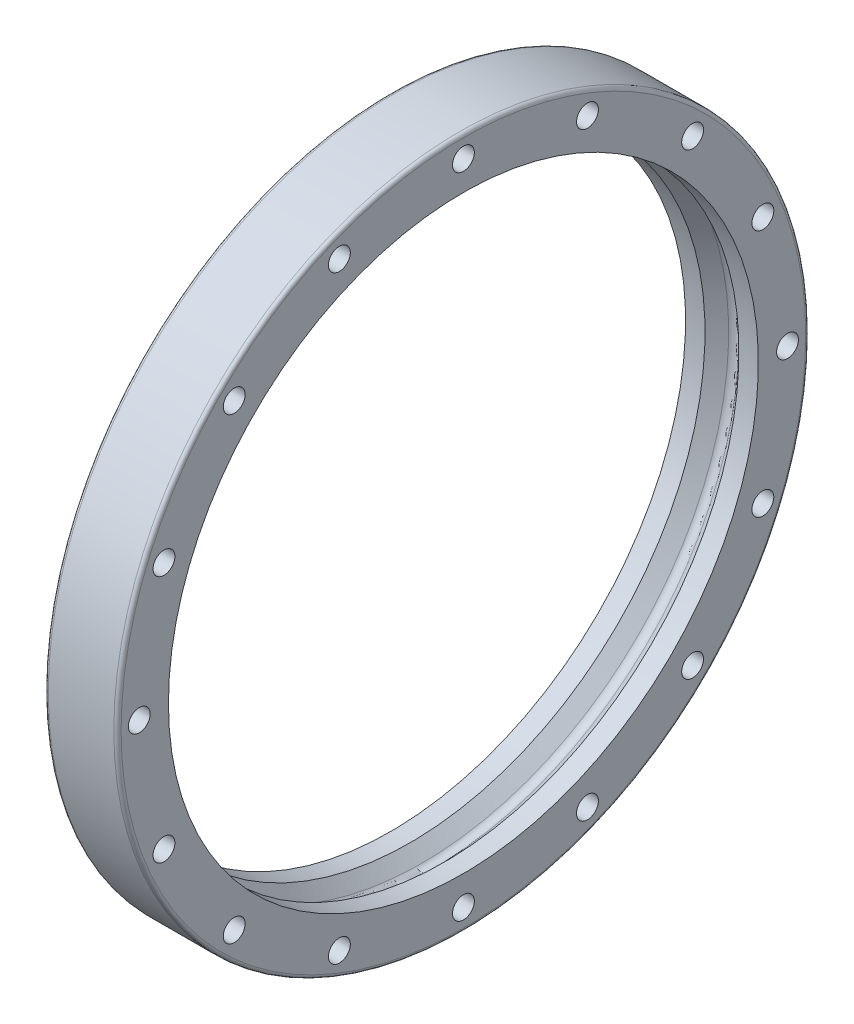
ISO-10303-21;
HEADER;
FILE_DESCRIPTION(('STEP AP214'),'2;1');
FILE_NAME('part.step','',(''),(''),'','','');
FILE_SCHEMA(('AUTOMOTIVE_DESIGN { 1 0 10303 214 1 1 1 1 }'));
ENDSEC;
DATA;
#1=APPLICATION_CONTEXT('core data for automotive mechanical design processes');
#2=APPLICATION_PROTOCOL_DEFINITION('international standard','automotive_design',2000,#1);
#3=PRODUCT_CONTEXT('',#1,'mechanical');
#4=PRODUCT('Part','Part','',(#3));
#5=PRODUCT_RELATED_PRODUCT_CATEGORY('part','',(#4));
#6=PRODUCT_DEFINITION_FORMATION('','',#4);
#7=PRODUCT_DEFINITION_CONTEXT('part definition',#1,'design');
#8=PRODUCT_DEFINITION('design','',#6,#7);
#9=PRODUCT_DEFINITION_SHAPE('','',#8);
#10=(LENGTH_UNIT() NAMED_UNIT(*) SI_UNIT(.MILLI.,.METRE.));
#11=(NAMED_UNIT(*) PLANE_ANGLE_UNIT() SI_UNIT($,.RADIAN.));
#12=(NAMED_UNIT(*) SI_UNIT($,.STERADIAN.) SOLID_ANGLE_UNIT());
#13=UNCERTAINTY_MEASURE_WITH_UNIT(LENGTH_MEASURE(1.E-05),#10,'distance_accuracy_value','');
#14=(GEOMETRIC_REPRESENTATION_CONTEXT(3) GLOBAL_UNCERTAINTY_ASSIGNED_CONTEXT((#13)) GLOBAL_UNIT_ASSIGNED_CONTEXT((#10,
#11,#12)) REPRESENTATION_CONTEXT('',''));
#15=CARTESIAN_POINT('',(0.,0.,0.));
#16=DIRECTION('',(0.,0.,1.));
#17=DIRECTION('',(1.,0.,0.));
#18=AXIS2_PLACEMENT_3D('',#15,#16,#17);
#19=CARTESIAN_POINT('',(0.,0.,0.));
#20=DIRECTION('',(1.,0.,0.));
#21=DIRECTION('',(0.,0.,-1.));
#22=AXIS2_PLACEMENT_3D('',#19,#20,#21);
#23=CONICAL_SURFACE('',#22,85.6568542494924,0.78539816339745);
#24=CARTESIAN_POINT('',(-1.4142135623731,0.,0.));
#25=DIRECTION('',(-1.,0.,0.));
#26=DIRECTION('',(0.,0.,1.));
#27=AXIS2_PLACEMENT_3D('',#24,#25,#26);
#28=CIRCLE('',#27,84.2426406871193);
#29=CARTESIAN_POINT('',(-1.4142135623731,0.,84.2426406871193));
#30=VERTEX_POINT('',#29);
#31=EDGE_CURVE('E53',#30,#30,#28,.F.);
#32=ORIENTED_EDGE('',*,*,#31,.T.);
#33=EDGE_LOOP('',(#32));
#34=FACE_BOUND('',#33,.T.);
#35=CARTESIAN_POINT('',(-4.65685424949237,0.,0.));
#36=DIRECTION('',(-1.,0.,0.));
#37=DIRECTION('',(0.,0.,1.));
#38=AXIS2_PLACEMENT_3D('',#35,#36,#37);
#39=CIRCLE('',#38,81.);
#40=CARTESIAN_POINT('',(-4.65685424949237,0.,81.));
#41=VERTEX_POINT('',#40);
#42=EDGE_CURVE('E68',#41,#41,#39,.T.);
#43=ORIENTED_EDGE('',*,*,#42,.T.);
#44=EDGE_LOOP('',(#43));
#45=FACE_BOUND('',#44,.T.);
#46=ADVANCED_FACE('F33',(#34,#45),#23,.F.);
#47=CARTESIAN_POINT('',(0.,0.,0.));
#48=DIRECTION('',(-1.,0.,0.));
#49=DIRECTION('',(0.,0.,1.));
#50=AXIS2_PLACEMENT_3D('',#47,#48,#49);
#51=CONICAL_SURFACE('',#50,85.6568542494924,0.78539816339745);
#52=CARTESIAN_POINT('',(1.41421356237313,0.,0.));
#53=DIRECTION('',(1.,0.,0.));
#54=DIRECTION('',(0.,0.,-1.));
#55=AXIS2_PLACEMENT_3D('',#52,#53,#54);
#56=CIRCLE('',#55,84.2426406871193);
#57=CARTESIAN_POINT('',(1.41421356237313,0.,-84.2426406871193));
#58=VERTEX_POINT('',#57);
#59=EDGE_CURVE('E56',#58,#58,#56,.F.);
#60=ORIENTED_EDGE('',*,*,#59,.T.);
#61=EDGE_LOOP('',(#60));
#62=FACE_BOUND('',#61,.T.);
#63=CARTESIAN_POINT('',(4.65685424949238,0.,0.));
#64=DIRECTION('',(-1.,0.,0.));
#65=DIRECTION('',(0.,0.,1.));
#66=AXIS2_PLACEMENT_3D('',#63,#64,#65);
#67=CIRCLE('',#66,81.);
#68=CARTESIAN_POINT('',(4.65685424949238,0.,81.));
#69=VERTEX_POINT('',#68);
#70=EDGE_CURVE('E59',#69,#69,#67,.T.);
#71=ORIENTED_EDGE('',*,*,#70,.F.);
#72=EDGE_LOOP('',(#71));
#73=FACE_BOUND('',#72,.T.);
#74=ADVANCED_FACE('F202',(#62,#73),#51,.F.);
#75=CARTESIAN_POINT('',(-42.0673076923077,0.,0.));
#76=DIRECTION('',(-1.,0.,0.));
#77=DIRECTION('',(0.,0.,1.));
#78=AXIS2_PLACEMENT_3D('',#75,#76,#77);
#79=CYLINDRICAL_SURFACE('',#78,81.);
#80=ORIENTED_EDGE('',*,*,#70,.T.);
#81=EDGE_LOOP('',(#80));
#82=FACE_BOUND('',#81,.T.);
#83=CARTESIAN_POINT('',(10.,0.,0.));
#84=DIRECTION('',(-1.,0.,0.));
#85=DIRECTION('',(0.,0.,1.));
#86=AXIS2_PLACEMENT_3D('',#83,#84,#85);
#87=CIRCLE('',#86,81.);
#88=CARTESIAN_POINT('',(10.,0.,81.));
#89=VERTEX_POINT('',#88);
#90=EDGE_CURVE('E62',#89,#89,#87,.T.);
#91=ORIENTED_EDGE('',*,*,#90,.F.);
#92=EDGE_LOOP('',(#91));
#93=FACE_BOUND('',#92,.T.);
#94=ADVANCED_FACE('F183',(#82,#93),#79,.F.);
#95=CARTESIAN_POINT('',(10.,0.,0.));
#96=DIRECTION('',(1.,0.,0.));
#97=DIRECTION('',(0.,0.,-1.));
#98=AXIS2_PLACEMENT_3D('',#95,#96,#97);
#99=PLANE('',#98);
#100=CARTESIAN_POINT('',(10.,0.,0.));
#101=DIRECTION('',(1.,0.,0.));
#102=DIRECTION('',(0.,0.,-1.));
#103=AXIS2_PLACEMENT_3D('',#100,#101,#102);
#104=CIRCLE('',#103,94.);
#105=CARTESIAN_POINT('',(10.,0.,-94.));
#106=VERTEX_POINT('',#105);
#107=EDGE_CURVE('E40',#106,#106,#104,.T.);
#108=ORIENTED_EDGE('',*,*,#107,.T.);
#109=EDGE_LOOP('',(#108));
#110=FACE_BOUND('',#109,.T.);
#111=CARTESIAN_POINT('',(10.,62.9325035256026,-62.9325035256028));
#112=DIRECTION('',(1.,0.,0.));
#113=DIRECTION('',(0.,-0.707106781186549,-0.707106781186546));
#114=AXIS2_PLACEMENT_3D('',#111,#112,#113);
#115=CIRCLE('',#114,3.);
#116=CARTESIAN_POINT('',(10.,60.811183182043,-65.0538238691625));
#117=VERTEX_POINT('',#116);
#118=EDGE_CURVE('E127',#117,#117,#115,.T.);
#119=ORIENTED_EDGE('',*,*,#118,.F.);
#120=EDGE_LOOP('',(#119));
#121=FACE_BOUND('',#120,.T.);
#122=CARTESIAN_POINT('',(10.,34.0588254804928,-82.2252783935046));
#123=DIRECTION('',(1.,0.,0.));
#124=DIRECTION('',(0.,-0.923879532511288,-0.382683432365087));
#125=AXIS2_PLACEMENT_3D('',#122,#123,#124);
#126=CIRCLE('',#125,3.);
#127=CARTESIAN_POINT('',(10.,31.2871868829589,-83.3733286905999));
#128=VERTEX_POINT('',#127);
#129=EDGE_CURVE('E121',#128,#128,#126,.T.);
#130=ORIENTED_EDGE('',*,*,#129,.F.);
#131=EDGE_LOOP('',(#130));
#132=FACE_BOUND('',#131,.T.);
#133=CARTESIAN_POINT('',(10.,-3.10741839157039E-13,-89.));
#134=DIRECTION('',(1.,0.,0.));
#135=DIRECTION('',(0.,-1.,0.));
#136=AXIS2_PLACEMENT_3D('',#133,#134,#135);
#137=CIRCLE('',#136,3.);
#138=CARTESIAN_POINT('',(10.,-3.00000000000031,-89.));
#139=VERTEX_POINT('',#138);
#140=EDGE_CURVE('E115',#139,#139,#137,.T.);
#141=ORIENTED_EDGE('',*,*,#140,.F.);
#142=EDGE_LOOP('',(#141));
#143=FACE_BOUND('',#142,.T.);
#144=CARTESIAN_POINT('',(10.,-34.0588254804934,-82.2252783935044));
#145=DIRECTION('',(1.,0.,0.));
#146=DIRECTION('',(0.,-0.923879532511285,0.382683432365094));
#147=AXIS2_PLACEMENT_3D('',#144,#145,#146);
#148=CIRCLE('',#147,3.);
#149=CARTESIAN_POINT('',(10.,-36.8304640780272,-81.0772280964091));
#150=VERTEX_POINT('',#149);
#151=EDGE_CURVE('E109',#150,#150,#148,.T.);
#152=ORIENTED_EDGE('',*,*,#151,.F.);
#153=EDGE_LOOP('',(#152));
#154=FACE_BOUND('',#153,.T.);
#155=CARTESIAN_POINT('',(10.,-62.9325035256031,-62.9325035256024));
#156=DIRECTION('',(1.,0.,0.));
#157=DIRECTION('',(0.,-0.707106781186544,0.707106781186551));
#158=AXIS2_PLACEMENT_3D('',#155,#156,#157);
#159=CIRCLE('',#158,3.);
#160=CARTESIAN_POINT('',(10.,-65.0538238691627,-60.8111831820427));
#161=VERTEX_POINT('',#160);
#162=EDGE_CURVE('E103',#161,#161,#159,.T.);
#163=ORIENTED_EDGE('',*,*,#162,.F.);
#164=EDGE_LOOP('',(#163));
#165=FACE_BOUND('',#164,.T.);
#166=CARTESIAN_POINT('',(10.,-82.2252783935047,-34.0588254804925));
#167=DIRECTION('',(1.,0.,0.));
#168=DIRECTION('',(0.,-0.382683432365084,0.923879532511289));
#169=AXIS2_PLACEMENT_3D('',#166,#167,#168);
#170=CIRCLE('',#169,3.);
#171=CARTESIAN_POINT('',(10.,-83.3733286906,-31.2871868829586));
#172=VERTEX_POINT('',#171);
#173=EDGE_CURVE('E97',#172,#172,#170,.T.);
#174=ORIENTED_EDGE('',*,*,#173,.F.);
#175=EDGE_LOOP('',(#174));
#176=FACE_BOUND('',#175,.T.);
#177=CARTESIAN_POINT('',(10.,-89.,0.));
#178=DIRECTION('',(1.,0.,0.));
#179=DIRECTION('',(0.,0.,1.));
#180=AXIS2_PLACEMENT_3D('',#177,#178,#179);
#181=CIRCLE('',#180,3.);
#182=CARTESIAN_POINT('',(10.,-89.,3.));
#183=VERTEX_POINT('',#182);
#184=EDGE_CURVE('E91',#183,#183,#181,.T.);
#185=ORIENTED_EDGE('',*,*,#184,.F.);
#186=EDGE_LOOP('',(#185));
#187=FACE_BOUND('',#186,.T.);
#188=CARTESIAN_POINT('',(10.,-82.2252783935043,34.0588254804936));
#189=DIRECTION('',(1.,0.,0.));
#190=DIRECTION('',(0.,0.382683432365097,0.923879532511284));
#191=AXIS2_PLACEMENT_3D('',#188,#189,#190);
#192=CIRCLE('',#191,3.);
#193=CARTESIAN_POINT('',(10.,-81.077228096409,36.8304640780275));
#194=VERTEX_POINT('',#193);
#195=EDGE_CURVE('E84',#194,#194,#192,.T.);
#196=ORIENTED_EDGE('',*,*,#195,.F.);
#197=EDGE_LOOP('',(#196));
#198=FACE_BOUND('',#197,.T.);
#199=CARTESIAN_POINT('',(10.,-62.9325035256022,62.9325035256033));
#200=DIRECTION('',(1.,0.,0.));
#201=DIRECTION('',(0.,0.707106781186554,0.707106781186541));
#202=AXIS2_PLACEMENT_3D('',#199,#200,#201);
#203=CIRCLE('',#202,3.);
#204=CARTESIAN_POINT('',(10.,-60.8111831820425,65.0538238691629));
#205=VERTEX_POINT('',#204);
#206=EDGE_CURVE('E162',#205,#205,#203,.T.);
#207=ORIENTED_EDGE('',*,*,#206,.F.);
#208=EDGE_LOOP('',(#207));
#209=FACE_BOUND('',#208,.T.);
#210=CARTESIAN_POINT('',(10.,-34.0588254804922,82.2252783935049));
#211=DIRECTION('',(1.,0.,0.));
#212=DIRECTION('',(0.,0.923879532511291,0.382683432365081));
#213=AXIS2_PLACEMENT_3D('',#210,#211,#212);
#214=CIRCLE('',#213,3.);
#215=CARTESIAN_POINT('',(10.,-31.2871868829583,83.3733286906001));
#216=VERTEX_POINT('',#215);
#217=EDGE_CURVE('E156',#216,#216,#214,.T.);
#218=ORIENTED_EDGE('',*,*,#217,.F.);
#219=EDGE_LOOP('',(#218));
#220=FACE_BOUND('',#219,.T.);
#221=CARTESIAN_POINT('',(10.,9.32225517471117E-13,89.));
#222=DIRECTION('',(1.,0.,0.));
#223=DIRECTION('',(0.,1.,0.));
#224=AXIS2_PLACEMENT_3D('',#221,#222,#223);
#225=CIRCLE('',#224,3.);
#226=CARTESIAN_POINT('',(10.,3.00000000000094,89.));
#227=VERTEX_POINT('',#226);
#228=EDGE_CURVE('E150',#227,#227,#225,.T.);
#229=ORIENTED_EDGE('',*,*,#228,.F.);
#230=EDGE_LOOP('',(#229));
#231=FACE_BOUND('',#230,.T.);
#232=CARTESIAN_POINT('',(10.,34.0588254804939,82.2252783935041));
#233=DIRECTION('',(1.,0.,0.));
#234=DIRECTION('',(0.,0.923879532511283,-0.3826834323651));
#235=AXIS2_PLACEMENT_3D('',#232,#233,#234);
#236=CIRCLE('',#235,3.);
#237=CARTESIAN_POINT('',(10.,36.8304640780277,81.0772280964088));
#238=VERTEX_POINT('',#237);
#239=EDGE_CURVE('E144',#238,#238,#236,.T.);
#240=ORIENTED_EDGE('',*,*,#239,.F.);
#241=EDGE_LOOP('',(#240));
#242=FACE_BOUND('',#241,.T.);
#243=CARTESIAN_POINT('',(10.,62.9325035256035,62.932503525602));
#244=DIRECTION('',(1.,0.,0.));
#245=DIRECTION('',(0.,0.707106781186539,-0.707106781186556));
#246=AXIS2_PLACEMENT_3D('',#243,#244,#245);
#247=CIRCLE('',#246,3.);
#248=CARTESIAN_POINT('',(10.,65.0538238691631,60.8111831820423));
#249=VERTEX_POINT('',#248);
#250=EDGE_CURVE('E138',#249,#249,#247,.T.);
#251=ORIENTED_EDGE('',*,*,#250,.F.);
#252=EDGE_LOOP('',(#251));
#253=FACE_BOUND('',#252,.T.);
#254=CARTESIAN_POINT('',(10.,82.225278393505,34.0588254804919));
#255=DIRECTION('',(1.,0.,0.));
#256=DIRECTION('',(0.,0.382683432365077,-0.923879532511292));
#257=AXIS2_PLACEMENT_3D('',#254,#255,#256);
#258=CIRCLE('',#257,3.);
#259=CARTESIAN_POINT('',(10.,83.3733286906002,31.287186882958));
#260=VERTEX_POINT('',#259);
#261=EDGE_CURVE('E132',#260,#260,#258,.T.);
#262=ORIENTED_EDGE('',*,*,#261,.F.);
#263=EDGE_LOOP('',(#262));
#264=FACE_BOUND('',#263,.T.);
#265=CARTESIAN_POINT('',(10.,82.2252783935045,-34.0588254804931));
#266=DIRECTION('',(1.,0.,0.));
#267=DIRECTION('',(0.,-0.382683432365091,-0.923879532511287));
#268=AXIS2_PLACEMENT_3D('',#265,#266,#267);
#269=CIRCLE('',#268,3.);
#270=CARTESIAN_POINT('',(10.,81.0772280964092,-36.8304640780269));
#271=VERTEX_POINT('',#270);
#272=EDGE_CURVE('E78',#271,#271,#269,.T.);
#273=ORIENTED_EDGE('',*,*,#272,.F.);
#274=EDGE_LOOP('',(#273));
#275=FACE_BOUND('',#274,.T.);
#276=CARTESIAN_POINT('',(10.,89.,0.));
#277=DIRECTION('',(1.,0.,0.));
#278=DIRECTION('',(0.,0.,-1.));
#279=AXIS2_PLACEMENT_3D('',#276,#277,#278);
#280=CIRCLE('',#279,3.);
#281=CARTESIAN_POINT('',(10.,89.,-3.));
#282=VERTEX_POINT('',#281);
#283=EDGE_CURVE('E72',#282,#282,#280,.T.);
#284=ORIENTED_EDGE('',*,*,#283,.F.);
#285=EDGE_LOOP('',(#284));
#286=FACE_BOUND('',#285,.T.);
#287=ORIENTED_EDGE('',*,*,#90,.T.);
#288=EDGE_LOOP('',(#287));
#289=FACE_BOUND('',#288,.T.);
#290=ADVANCED_FACE('F179',(#110,#121,#132,#143,#154,#165,#176,#187,#198,#209,#220,#231,#242,
#253,#264,#275,#286,#289),#99,.T.);
#291=CARTESIAN_POINT('',(-42.0673076923077,0.,0.));
#292=DIRECTION('',(-1.,0.,0.));
#293=DIRECTION('',(0.,0.,1.));
#294=AXIS2_PLACEMENT_3D('',#291,#292,#293);
#295=CYLINDRICAL_SURFACE('',#294,95.);
#296=CARTESIAN_POINT('',(9.,0.,0.));
#297=DIRECTION('',(1.,0.,0.));
#298=DIRECTION('',(0.,0.,-1.));
#299=AXIS2_PLACEMENT_3D('',#296,#297,#298);
#300=CIRCLE('',#299,95.);
#301=CARTESIAN_POINT('',(9.,0.,-95.));
#302=VERTEX_POINT('',#301);
#303=EDGE_CURVE('E44',#302,#302,#300,.F.);
#304=ORIENTED_EDGE('',*,*,#303,.T.);
#305=EDGE_LOOP('',(#304));
#306=FACE_BOUND('',#305,.T.);
#307=CARTESIAN_POINT('',(-9.,0.,0.));
#308=DIRECTION('',(1.,0.,0.));
#309=DIRECTION('',(0.,0.,-1.));
#310=AXIS2_PLACEMENT_3D('',#307,#308,#309);
#311=CIRCLE('',#310,95.);
#312=CARTESIAN_POINT('',(-9.,0.,-95.));
#313=VERTEX_POINT('',#312);
#314=EDGE_CURVE('E48',#313,#313,#311,.T.);
#315=ORIENTED_EDGE('',*,*,#314,.T.);
#316=EDGE_LOOP('',(#315));
#317=FACE_BOUND('',#316,.T.);
#318=ADVANCED_FACE('F182',(#306,#317),#295,.T.);
#319=CARTESIAN_POINT('',(-10.,0.,0.));
#320=DIRECTION('',(1.,0.,0.));
#321=DIRECTION('',(0.,0.,-1.));
#322=AXIS2_PLACEMENT_3D('',#319,#320,#321);
#323=PLANE('',#322);
#324=CARTESIAN_POINT('',(-10.,0.,0.));
#325=DIRECTION('',(1.,0.,0.));
#326=DIRECTION('',(0.,0.,-1.));
#327=AXIS2_PLACEMENT_3D('',#324,#325,#326);
#328=CIRCLE('',#327,94.);
#329=CARTESIAN_POINT('',(-10.,0.,-94.));
#330=VERTEX_POINT('',#329);
#331=EDGE_CURVE('E10',#330,#330,#328,.F.);
#332=ORIENTED_EDGE('',*,*,#331,.T.);
#333=EDGE_LOOP('',(#332));
#334=FACE_BOUND('',#333,.T.);
#335=CARTESIAN_POINT('',(-10.,62.9325035256026,-62.9325035256028));
#336=DIRECTION('',(1.,0.,0.));
#337=DIRECTION('',(0.,-0.707106781186549,-0.707106781186546));
#338=AXIS2_PLACEMENT_3D('',#335,#336,#337);
#339=CIRCLE('',#338,3.);
#340=CARTESIAN_POINT('',(-10.,60.811183182043,-65.0538238691625));
#341=VERTEX_POINT('',#340);
#342=EDGE_CURVE('E81',#341,#341,#339,.T.);
#343=ORIENTED_EDGE('',*,*,#342,.T.);
#344=EDGE_LOOP('',(#343));
#345=FACE_BOUND('',#344,.T.);
#346=CARTESIAN_POINT('',(-10.,34.0588254804928,-82.2252783935046));
#347=DIRECTION('',(1.,0.,0.));
#348=DIRECTION('',(0.,-0.923879532511288,-0.382683432365087));
#349=AXIS2_PLACEMENT_3D('',#346,#347,#348);
#350=CIRCLE('',#349,3.);
#351=CARTESIAN_POINT('',(-10.,31.2871868829589,-83.3733286905999));
#352=VERTEX_POINT('',#351);
#353=EDGE_CURVE('E124',#352,#352,#350,.T.);
#354=ORIENTED_EDGE('',*,*,#353,.T.);
#355=EDGE_LOOP('',(#354));
#356=FACE_BOUND('',#355,.T.);
#357=CARTESIAN_POINT('',(-10.,-3.10741839157039E-13,-89.));
#358=DIRECTION('',(1.,0.,0.));
#359=DIRECTION('',(0.,-1.,0.));
#360=AXIS2_PLACEMENT_3D('',#357,#358,#359);
#361=CIRCLE('',#360,3.);
#362=CARTESIAN_POINT('',(-10.,-3.00000000000031,-89.));
#363=VERTEX_POINT('',#362);
#364=EDGE_CURVE('E118',#363,#363,#361,.T.);
#365=ORIENTED_EDGE('',*,*,#364,.T.);
#366=EDGE_LOOP('',(#365));
#367=FACE_BOUND('',#366,.T.);
#368=CARTESIAN_POINT('',(-10.,-34.0588254804934,-82.2252783935044));
#369=DIRECTION('',(1.,0.,0.));
#370=DIRECTION('',(0.,-0.923879532511285,0.382683432365094));
#371=AXIS2_PLACEMENT_3D('',#368,#369,#370);
#372=CIRCLE('',#371,3.);
#373=CARTESIAN_POINT('',(-10.,-36.8304640780272,-81.0772280964091));
#374=VERTEX_POINT('',#373);
#375=EDGE_CURVE('E112',#374,#374,#372,.T.);
#376=ORIENTED_EDGE('',*,*,#375,.T.);
#377=EDGE_LOOP('',(#376));
#378=FACE_BOUND('',#377,.T.);
#379=CARTESIAN_POINT('',(-10.,-62.9325035256031,-62.9325035256024));
#380=DIRECTION('',(1.,0.,0.));
#381=DIRECTION('',(0.,-0.707106781186544,0.707106781186551));
#382=AXIS2_PLACEMENT_3D('',#379,#380,#381);
#383=CIRCLE('',#382,3.);
#384=CARTESIAN_POINT('',(-10.,-65.0538238691627,-60.8111831820427));
#385=VERTEX_POINT('',#384);
#386=EDGE_CURVE('E106',#385,#385,#383,.T.);
#387=ORIENTED_EDGE('',*,*,#386,.T.);
#388=EDGE_LOOP('',(#387));
#389=FACE_BOUND('',#388,.T.);
#390=CARTESIAN_POINT('',(-10.,-82.2252783935047,-34.0588254804925));
#391=DIRECTION('',(1.,0.,0.));
#392=DIRECTION('',(0.,-0.382683432365084,0.923879532511289));
#393=AXIS2_PLACEMENT_3D('',#390,#391,#392);
#394=CIRCLE('',#393,3.);
#395=CARTESIAN_POINT('',(-10.,-83.3733286906,-31.2871868829586));
#396=VERTEX_POINT('',#395);
#397=EDGE_CURVE('E100',#396,#396,#394,.T.);
#398=ORIENTED_EDGE('',*,*,#397,.T.);
#399=EDGE_LOOP('',(#398));
#400=FACE_BOUND('',#399,.T.);
#401=CARTESIAN_POINT('',(-10.,-89.,0.));
#402=DIRECTION('',(1.,0.,0.));
#403=DIRECTION('',(0.,0.,1.));
#404=AXIS2_PLACEMENT_3D('',#401,#402,#403);
#405=CIRCLE('',#404,3.);
#406=CARTESIAN_POINT('',(-10.,-89.,3.));
#407=VERTEX_POINT('',#406);
#408=EDGE_CURVE('E94',#407,#407,#405,.T.);
#409=ORIENTED_EDGE('',*,*,#408,.T.);
#410=EDGE_LOOP('',(#409));
#411=FACE_BOUND('',#410,.T.);
#412=CARTESIAN_POINT('',(-10.,-82.2252783935043,34.0588254804936));
#413=DIRECTION('',(1.,0.,0.));
#414=DIRECTION('',(0.,0.382683432365097,0.923879532511284));
#415=AXIS2_PLACEMENT_3D('',#412,#413,#414);
#416=CIRCLE('',#415,3.);
#417=CARTESIAN_POINT('',(-10.,-81.077228096409,36.8304640780275));
#418=VERTEX_POINT('',#417);
#419=EDGE_CURVE('E87',#418,#418,#416,.T.);
#420=ORIENTED_EDGE('',*,*,#419,.T.);
#421=EDGE_LOOP('',(#420));
#422=FACE_BOUND('',#421,.T.);
#423=CARTESIAN_POINT('',(-10.,-62.9325035256022,62.9325035256033));
#424=DIRECTION('',(1.,0.,0.));
#425=DIRECTION('',(0.,0.707106781186554,0.707106781186541));
#426=AXIS2_PLACEMENT_3D('',#423,#424,#425);
#427=CIRCLE('',#426,3.);
#428=CARTESIAN_POINT('',(-10.,-60.8111831820425,65.0538238691629));
#429=VERTEX_POINT('',#428);
#430=EDGE_CURVE('E88',#429,#429,#427,.T.);
#431=ORIENTED_EDGE('',*,*,#430,.T.);
#432=EDGE_LOOP('',(#431));
#433=FACE_BOUND('',#432,.T.);
#434=CARTESIAN_POINT('',(-10.,-34.0588254804922,82.2252783935049));
#435=DIRECTION('',(1.,0.,0.));
#436=DIRECTION('',(0.,0.923879532511291,0.382683432365081));
#437=AXIS2_PLACEMENT_3D('',#434,#435,#436);
#438=CIRCLE('',#437,3.);
#439=CARTESIAN_POINT('',(-10.,-31.2871868829583,83.3733286906001));
#440=VERTEX_POINT('',#439);
#441=EDGE_CURVE('E159',#440,#440,#438,.T.);
#442=ORIENTED_EDGE('',*,*,#441,.T.);
#443=EDGE_LOOP('',(#442));
#444=FACE_BOUND('',#443,.T.);
#445=CARTESIAN_POINT('',(-10.,9.32225517471117E-13,89.));
#446=DIRECTION('',(1.,0.,0.));
#447=DIRECTION('',(0.,1.,0.));
#448=AXIS2_PLACEMENT_3D('',#445,#446,#447);
#449=CIRCLE('',#448,3.);
#450=CARTESIAN_POINT('',(-10.,3.00000000000094,89.));
#451=VERTEX_POINT('',#450);
#452=EDGE_CURVE('E153',#451,#451,#449,.T.);
#453=ORIENTED_EDGE('',*,*,#452,.T.);
#454=EDGE_LOOP('',(#453));
#455=FACE_BOUND('',#454,.T.);
#456=CARTESIAN_POINT('',(-10.,34.0588254804939,82.2252783935041));
#457=DIRECTION('',(1.,0.,0.));
#458=DIRECTION('',(0.,0.923879532511283,-0.3826834323651));
#459=AXIS2_PLACEMENT_3D('',#456,#457,#458);
#460=CIRCLE('',#459,3.);
#461=CARTESIAN_POINT('',(-10.,36.8304640780277,81.0772280964088));
#462=VERTEX_POINT('',#461);
#463=EDGE_CURVE('E147',#462,#462,#460,.T.);
#464=ORIENTED_EDGE('',*,*,#463,.T.);
#465=EDGE_LOOP('',(#464));
#466=FACE_BOUND('',#465,.T.);
#467=CARTESIAN_POINT('',(-10.,62.9325035256035,62.932503525602));
#468=DIRECTION('',(1.,0.,0.));
#469=DIRECTION('',(0.,0.707106781186539,-0.707106781186556));
#470=AXIS2_PLACEMENT_3D('',#467,#468,#469);
#471=CIRCLE('',#470,3.);
#472=CARTESIAN_POINT('',(-10.,65.0538238691631,60.8111831820423));
#473=VERTEX_POINT('',#472);
#474=EDGE_CURVE('E141',#473,#473,#471,.T.);
#475=ORIENTED_EDGE('',*,*,#474,.T.);
#476=EDGE_LOOP('',(#475));
#477=FACE_BOUND('',#476,.T.);
#478=CARTESIAN_POINT('',(-10.,82.225278393505,34.0588254804919));
#479=DIRECTION('',(1.,0.,0.));
#480=DIRECTION('',(0.,0.382683432365077,-0.923879532511292));
#481=AXIS2_PLACEMENT_3D('',#478,#479,#480);
#482=CIRCLE('',#481,3.);
#483=CARTESIAN_POINT('',(-10.,83.3733286906002,31.287186882958));
#484=VERTEX_POINT('',#483);
#485=EDGE_CURVE('E135',#484,#484,#482,.T.);
#486=ORIENTED_EDGE('',*,*,#485,.T.);
#487=EDGE_LOOP('',(#486));
#488=FACE_BOUND('',#487,.T.);
#489=CARTESIAN_POINT('',(-10.,82.2252783935045,-34.0588254804931));
#490=DIRECTION('',(1.,0.,0.));
#491=DIRECTION('',(0.,-0.382683432365091,-0.923879532511287));
#492=AXIS2_PLACEMENT_3D('',#489,#490,#491);
#493=CIRCLE('',#492,3.);
#494=CARTESIAN_POINT('',(-10.,81.0772280964092,-36.8304640780269));
#495=VERTEX_POINT('',#494);
#496=EDGE_CURVE('E75',#495,#495,#493,.T.);
#497=ORIENTED_EDGE('',*,*,#496,.T.);
#498=EDGE_LOOP('',(#497));
#499=FACE_BOUND('',#498,.T.);
#500=CARTESIAN_POINT('',(-10.,89.,0.));
#501=DIRECTION('',(1.,0.,0.));
#502=DIRECTION('',(0.,0.,-1.));
#503=AXIS2_PLACEMENT_3D('',#500,#501,#502);
#504=CIRCLE('',#503,3.);
#505=CARTESIAN_POINT('',(-10.,89.,-3.));
#506=VERTEX_POINT('',#505);
#507=EDGE_CURVE('E71',#506,#506,#504,.T.);
#508=ORIENTED_EDGE('',*,*,#507,.T.);
#509=EDGE_LOOP('',(#508));
#510=FACE_BOUND('',#509,.T.);
#511=CARTESIAN_POINT('',(-10.,0.,0.));
#512=DIRECTION('',(-1.,0.,0.));
#513=DIRECTION('',(0.,0.,1.));
#514=AXIS2_PLACEMENT_3D('',#511,#512,#513);
#515=CIRCLE('',#514,81.);
#516=CARTESIAN_POINT('',(-10.,0.,81.));
#517=VERTEX_POINT('',#516);
#518=EDGE_CURVE('E65',#517,#517,#515,.T.);
#519=ORIENTED_EDGE('',*,*,#518,.F.);
#520=EDGE_LOOP('',(#519));
#521=FACE_BOUND('',#520,.T.);
#522=ADVANCED_FACE('F168',(#334,#345,#356,#367,#378,#389,#400,#411,#422,#433,#444,#455,#466,
#477,#488,#499,#510,#521),#323,.F.);
#523=ORIENTED_EDGE('',*,*,#518,.T.);
#524=EDGE_LOOP('',(#523));
#525=FACE_BOUND('',#524,.T.);
#526=ORIENTED_EDGE('',*,*,#42,.F.);
#527=EDGE_LOOP('',(#526));
#528=FACE_BOUND('',#527,.T.);
#529=ADVANCED_FACE('F205',(#525,#528),#79,.F.);
#530=CARTESIAN_POINT('',(0.,0.,0.));
#531=DIRECTION('',(-1.,0.,0.));
#532=DIRECTION('',(0.,0.,1.));
#533=AXIS2_PLACEMENT_3D('',#530,#531,#532);
#534=TOROIDAL_SURFACE('',#533,82.8284271247462,2.);
#535=ORIENTED_EDGE('',*,*,#31,.F.);
#536=EDGE_LOOP('',(#535));
#537=FACE_BOUND('',#536,.T.);
#538=ORIENTED_EDGE('',*,*,#59,.F.);
#539=EDGE_LOOP('',(#538));
#540=FACE_BOUND('',#539,.T.);
#541=ADVANCED_FACE('F214',(#537,#540),#534,.F.);
#542=CARTESIAN_POINT('',(-10.,89.,0.));
#543=DIRECTION('',(1.,0.,0.));
#544=DIRECTION('',(0.,0.,-1.));
#545=AXIS2_PLACEMENT_3D('',#542,#543,#544);
#546=CYLINDRICAL_SURFACE('',#545,3.);
#547=ORIENTED_EDGE('',*,*,#507,.F.);
#548=EDGE_LOOP('',(#547));
#549=FACE_BOUND('',#548,.T.);
#550=ORIENTED_EDGE('',*,*,#283,.T.);
#551=EDGE_LOOP('',(#550));
#552=FACE_BOUND('',#551,.T.);
#553=ADVANCED_FACE('F224',(#549,#552),#546,.F.);
#554=CARTESIAN_POINT('',(-10.,82.2252783935045,-34.0588254804931));
#555=DIRECTION('',(1.,0.,0.));
#556=DIRECTION('',(0.,0.,-1.));
#557=AXIS2_PLACEMENT_3D('',#554,#555,#556);
#558=CYLINDRICAL_SURFACE('',#557,3.);
#559=ORIENTED_EDGE('',*,*,#496,.F.);
#560=EDGE_LOOP('',(#559));
#561=FACE_BOUND('',#560,.T.);
#562=ORIENTED_EDGE('',*,*,#272,.T.);
#563=EDGE_LOOP('',(#562));
#564=FACE_BOUND('',#563,.T.);
#565=ADVANCED_FACE('F282',(#561,#564),#558,.F.);
#566=CARTESIAN_POINT('',(-10.,82.225278393505,34.0588254804919));
#567=DIRECTION('',(1.,0.,0.));
#568=DIRECTION('',(0.,0.,-1.));
#569=AXIS2_PLACEMENT_3D('',#566,#567,#568);
#570=CYLINDRICAL_SURFACE('',#569,3.);
#571=ORIENTED_EDGE('',*,*,#485,.F.);
#572=EDGE_LOOP('',(#571));
#573=FACE_BOUND('',#572,.T.);
#574=ORIENTED_EDGE('',*,*,#261,.T.);
#575=EDGE_LOOP('',(#574));
#576=FACE_BOUND('',#575,.T.);
#577=ADVANCED_FACE('F284',(#573,#576),#570,.F.);
#578=CARTESIAN_POINT('',(-10.,62.9325035256035,62.932503525602));
#579=DIRECTION('',(1.,0.,0.));
#580=DIRECTION('',(0.,0.,-1.));
#581=AXIS2_PLACEMENT_3D('',#578,#579,#580);
#582=CYLINDRICAL_SURFACE('',#581,3.);
#583=ORIENTED_EDGE('',*,*,#474,.F.);
#584=EDGE_LOOP('',(#583));
#585=FACE_BOUND('',#584,.T.);
#586=ORIENTED_EDGE('',*,*,#250,.T.);
#587=EDGE_LOOP('',(#586));
#588=FACE_BOUND('',#587,.T.);
#589=ADVANCED_FACE('F309',(#585,#588),#582,.F.);
#590=CARTESIAN_POINT('',(-10.,34.0588254804939,82.2252783935041));
#591=DIRECTION('',(1.,0.,0.));
#592=DIRECTION('',(0.,0.,-1.));
#593=AXIS2_PLACEMENT_3D('',#590,#591,#592);
#594=CYLINDRICAL_SURFACE('',#593,3.);
#595=ORIENTED_EDGE('',*,*,#463,.F.);
#596=EDGE_LOOP('',(#595));
#597=FACE_BOUND('',#596,.T.);
#598=ORIENTED_EDGE('',*,*,#239,.T.);
#599=EDGE_LOOP('',(#598));
#600=FACE_BOUND('',#599,.T.);
#601=ADVANCED_FACE('F317',(#597,#600),#594,.F.);
#602=CARTESIAN_POINT('',(-10.,9.32225517471117E-13,89.));
#603=DIRECTION('',(1.,0.,0.));
#604=DIRECTION('',(0.,0.,-1.));
#605=AXIS2_PLACEMENT_3D('',#602,#603,#604);
#606=CYLINDRICAL_SURFACE('',#605,3.);
#607=ORIENTED_EDGE('',*,*,#452,.F.);
#608=EDGE_LOOP('',(#607));
#609=FACE_BOUND('',#608,.T.);
#610=ORIENTED_EDGE('',*,*,#228,.T.);
#611=EDGE_LOOP('',(#610));
#612=FACE_BOUND('',#611,.T.);
#613=ADVANCED_FACE('F325',(#609,#612),#606,.F.);
#614=CARTESIAN_POINT('',(-10.,-34.0588254804922,82.2252783935049));
#615=DIRECTION('',(1.,0.,0.));
#616=DIRECTION('',(0.,0.,-1.));
#617=AXIS2_PLACEMENT_3D('',#614,#615,#616);
#618=CYLINDRICAL_SURFACE('',#617,3.);
#619=ORIENTED_EDGE('',*,*,#441,.F.);
#620=EDGE_LOOP('',(#619));
#621=FACE_BOUND('',#620,.T.);
#622=ORIENTED_EDGE('',*,*,#217,.T.);
#623=EDGE_LOOP('',(#622));
#624=FACE_BOUND('',#623,.T.);
#625=ADVANCED_FACE('F175',(#621,#624),#618,.F.);
#626=CARTESIAN_POINT('',(-10.,-62.9325035256022,62.9325035256033));
#627=DIRECTION('',(1.,0.,0.));
#628=DIRECTION('',(0.,0.,-1.));
#629=AXIS2_PLACEMENT_3D('',#626,#627,#628);
#630=CYLINDRICAL_SURFACE('',#629,3.);
#631=ORIENTED_EDGE('',*,*,#430,.F.);
#632=EDGE_LOOP('',(#631));
#633=FACE_BOUND('',#632,.T.);
#634=ORIENTED_EDGE('',*,*,#206,.T.);
#635=EDGE_LOOP('',(#634));
#636=FACE_BOUND('',#635,.T.);
#637=ADVANCED_FACE('F171',(#633,#636),#630,.F.);
#638=CARTESIAN_POINT('',(-10.,-82.2252783935043,34.0588254804936));
#639=DIRECTION('',(1.,0.,0.));
#640=DIRECTION('',(0.,0.,-1.));
#641=AXIS2_PLACEMENT_3D('',#638,#639,#640);
#642=CYLINDRICAL_SURFACE('',#641,3.);
#643=ORIENTED_EDGE('',*,*,#419,.F.);
#644=EDGE_LOOP('',(#643));
#645=FACE_BOUND('',#644,.T.);
#646=ORIENTED_EDGE('',*,*,#195,.T.);
#647=EDGE_LOOP('',(#646));
#648=FACE_BOUND('',#647,.T.);
#649=ADVANCED_FACE('F174',(#645,#648),#642,.F.);
#650=CARTESIAN_POINT('',(-10.,-89.,0.));
#651=DIRECTION('',(1.,0.,0.));
#652=DIRECTION('',(0.,0.,-1.));
#653=AXIS2_PLACEMENT_3D('',#650,#651,#652);
#654=CYLINDRICAL_SURFACE('',#653,3.);
#655=ORIENTED_EDGE('',*,*,#408,.F.);
#656=EDGE_LOOP('',(#655));
#657=FACE_BOUND('',#656,.T.);
#658=ORIENTED_EDGE('',*,*,#184,.T.);
#659=EDGE_LOOP('',(#658));
#660=FACE_BOUND('',#659,.T.);
#661=ADVANCED_FACE('F270',(#657,#660),#654,.F.);
#662=CARTESIAN_POINT('',(-10.,-82.2252783935047,-34.0588254804925));
#663=DIRECTION('',(1.,0.,0.));
#664=DIRECTION('',(0.,0.,-1.));
#665=AXIS2_PLACEMENT_3D('',#662,#663,#664);
#666=CYLINDRICAL_SURFACE('',#665,3.);
#667=ORIENTED_EDGE('',*,*,#397,.F.);
#668=EDGE_LOOP('',(#667));
#669=FACE_BOUND('',#668,.T.);
#670=ORIENTED_EDGE('',*,*,#173,.T.);
#671=EDGE_LOOP('',(#670));
#672=FACE_BOUND('',#671,.T.);
#673=ADVANCED_FACE('F277',(#669,#672),#666,.F.);
#674=CARTESIAN_POINT('',(-10.,-62.9325035256031,-62.9325035256024));
#675=DIRECTION('',(1.,0.,0.));
#676=DIRECTION('',(0.,0.,-1.));
#677=AXIS2_PLACEMENT_3D('',#674,#675,#676);
#678=CYLINDRICAL_SURFACE('',#677,3.);
#679=ORIENTED_EDGE('',*,*,#386,.F.);
#680=EDGE_LOOP('',(#679));
#681=FACE_BOUND('',#680,.T.);
#682=ORIENTED_EDGE('',*,*,#162,.T.);
#683=EDGE_LOOP('',(#682));
#684=FACE_BOUND('',#683,.T.);
#685=ADVANCED_FACE('F364',(#681,#684),#678,.F.);
#686=CARTESIAN_POINT('',(-10.,-34.0588254804934,-82.2252783935044));
#687=DIRECTION('',(1.,0.,0.));
#688=DIRECTION('',(0.,0.,-1.));
#689=AXIS2_PLACEMENT_3D('',#686,#687,#688);
#690=CYLINDRICAL_SURFACE('',#689,3.);
#691=ORIENTED_EDGE('',*,*,#375,.F.);
#692=EDGE_LOOP('',(#691));
#693=FACE_BOUND('',#692,.T.);
#694=ORIENTED_EDGE('',*,*,#151,.T.);
#695=EDGE_LOOP('',(#694));
#696=FACE_BOUND('',#695,.T.);
#697=ADVANCED_FACE('F373',(#693,#696),#690,.F.);
#698=CARTESIAN_POINT('',(-10.,-3.10741839157039E-13,-89.));
#699=DIRECTION('',(1.,0.,0.));
#700=DIRECTION('',(0.,0.,-1.));
#701=AXIS2_PLACEMENT_3D('',#698,#699,#700);
#702=CYLINDRICAL_SURFACE('',#701,3.);
#703=ORIENTED_EDGE('',*,*,#364,.F.);
#704=EDGE_LOOP('',(#703));
#705=FACE_BOUND('',#704,.T.);
#706=ORIENTED_EDGE('',*,*,#140,.T.);
#707=EDGE_LOOP('',(#706));
#708=FACE_BOUND('',#707,.T.);
#709=ADVANCED_FACE('F383',(#705,#708),#702,.F.);
#710=CARTESIAN_POINT('',(-10.,34.0588254804928,-82.2252783935046));
#711=DIRECTION('',(1.,0.,0.));
#712=DIRECTION('',(0.,0.,-1.));
#713=AXIS2_PLACEMENT_3D('',#710,#711,#712);
#714=CYLINDRICAL_SURFACE('',#713,3.);
#715=ORIENTED_EDGE('',*,*,#353,.F.);
#716=EDGE_LOOP('',(#715));
#717=FACE_BOUND('',#716,.T.);
#718=ORIENTED_EDGE('',*,*,#129,.T.);
#719=EDGE_LOOP('',(#718));
#720=FACE_BOUND('',#719,.T.);
#721=ADVANCED_FACE('F235',(#717,#720),#714,.F.);
#722=CARTESIAN_POINT('',(-10.,62.9325035256026,-62.9325035256028));
#723=DIRECTION('',(1.,0.,0.));
#724=DIRECTION('',(0.,0.,-1.));
#725=AXIS2_PLACEMENT_3D('',#722,#723,#724);
#726=CYLINDRICAL_SURFACE('',#725,3.);
#727=ORIENTED_EDGE('',*,*,#342,.F.);
#728=EDGE_LOOP('',(#727));
#729=FACE_BOUND('',#728,.T.);
#730=ORIENTED_EDGE('',*,*,#118,.T.);
#731=EDGE_LOOP('',(#730));
#732=FACE_BOUND('',#731,.T.);
#733=ADVANCED_FACE('F228',(#729,#732),#726,.F.);
#734=CARTESIAN_POINT('',(9.,0.,0.));
#735=DIRECTION('',(1.,0.,0.));
#736=DIRECTION('',(0.,0.,-1.));
#737=AXIS2_PLACEMENT_3D('',#734,#735,#736);
#738=TOROIDAL_SURFACE('',#737,94.,1.);
#739=ORIENTED_EDGE('',*,*,#107,.F.);
#740=EDGE_LOOP('',(#739));
#741=FACE_BOUND('',#740,.T.);
#742=ORIENTED_EDGE('',*,*,#303,.F.);
#743=EDGE_LOOP('',(#742));
#744=FACE_BOUND('',#743,.T.);
#745=ADVANCED_FACE('F226',(#741,#744),#738,.T.);
#746=CARTESIAN_POINT('',(-9.,0.,0.));
#747=DIRECTION('',(1.,0.,0.));
#748=DIRECTION('',(0.,0.,-1.));
#749=AXIS2_PLACEMENT_3D('',#746,#747,#748);
#750=TOROIDAL_SURFACE('',#749,94.,1.);
#751=ORIENTED_EDGE('',*,*,#314,.F.);
#752=EDGE_LOOP('',(#751));
#753=FACE_BOUND('',#752,.T.);
#754=ORIENTED_EDGE('',*,*,#331,.F.);
#755=EDGE_LOOP('',(#754));
#756=FACE_BOUND('',#755,.T.);
#757=ADVANCED_FACE('F35',(#753,#756),#750,.T.);
#758=CLOSED_SHELL('',(#46,#74,#94,#290,#318,#522,#529,#541,#553,#565,#577,#589,#601,#613,#625,
#637,#649,#661,#673,#685,#697,#709,#721,#733,#745,#757));
#759=MANIFOLD_SOLID_BREP('B2',#758);
#760=ADVANCED_BREP_SHAPE_REPRESENTATION('',(#18,#759),#14);
#761=SHAPE_DEFINITION_REPRESENTATION(#9,#760);
ENDSEC;
END-ISO-10303-21;
